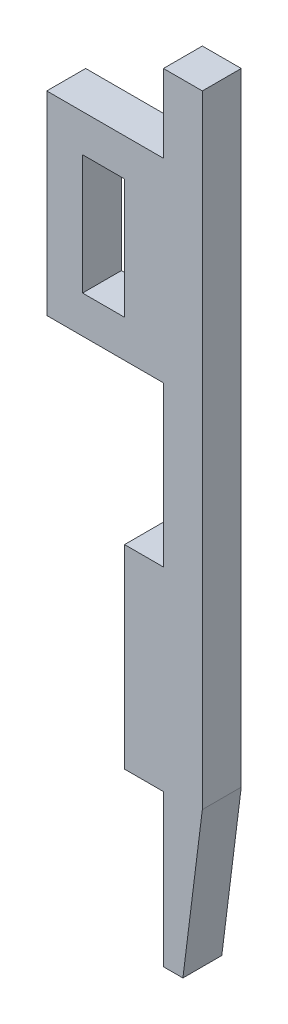
ISO-10303-21;
HEADER;
FILE_DESCRIPTION(('STEP AP214'),'2;1');
FILE_NAME('part.step','',(''),(''),'','','');
FILE_SCHEMA(('AUTOMOTIVE_DESIGN { 1 0 10303 214 1 1 1 1 }'));
ENDSEC;
DATA;
#1=APPLICATION_CONTEXT('core data for automotive mechanical design processes');
#2=APPLICATION_PROTOCOL_DEFINITION('international standard','automotive_design',2000,#1);
#3=PRODUCT_CONTEXT('',#1,'mechanical');
#4=PRODUCT('Part','Part','',(#3));
#5=PRODUCT_RELATED_PRODUCT_CATEGORY('part','',(#4));
#6=PRODUCT_DEFINITION_FORMATION('','',#4);
#7=PRODUCT_DEFINITION_CONTEXT('part definition',#1,'design');
#8=PRODUCT_DEFINITION('design','',#6,#7);
#9=PRODUCT_DEFINITION_SHAPE('','',#8);
#10=(LENGTH_UNIT() NAMED_UNIT(*) SI_UNIT(.MILLI.,.METRE.));
#11=(NAMED_UNIT(*) PLANE_ANGLE_UNIT() SI_UNIT($,.RADIAN.));
#12=(NAMED_UNIT(*) SI_UNIT($,.STERADIAN.) SOLID_ANGLE_UNIT());
#13=UNCERTAINTY_MEASURE_WITH_UNIT(LENGTH_MEASURE(1.E-05),#10,'distance_accuracy_value','');
#14=(GEOMETRIC_REPRESENTATION_CONTEXT(3) GLOBAL_UNCERTAINTY_ASSIGNED_CONTEXT((#13)) GLOBAL_UNIT_ASSIGNED_CONTEXT((#10,
#11,#12)) REPRESENTATION_CONTEXT('',''));
#15=CARTESIAN_POINT('',(0.,0.,0.));
#16=DIRECTION('',(0.,0.,1.));
#17=DIRECTION('',(1.,0.,0.));
#18=AXIS2_PLACEMENT_3D('',#15,#16,#17);
#19=CARTESIAN_POINT('',(0.,0.,5.));
#20=DIRECTION('',(0.,0.,1.));
#21=DIRECTION('',(1.,0.,0.));
#22=AXIS2_PLACEMENT_3D('',#19,#20,#21);
#23=PLANE('',#22);
#24=DIRECTION('',(0.,1.,0.));
#25=VECTOR('',#24,1.);
#26=CARTESIAN_POINT('',(-5.00000000000001,39.5,5.));
#27=LINE('',#26,#25);
#28=CARTESIAN_POINT('',(-5.,19.5,5.));
#29=VERTEX_POINT('',#28);
#30=CARTESIAN_POINT('',(-5.00000000000001,44.5,5.));
#31=VERTEX_POINT('',#30);
#32=EDGE_CURVE('E152',#29,#31,#27,.T.);
#33=ORIENTED_EDGE('',*,*,#32,.F.);
#34=DIRECTION('',(1.,0.,0.));
#35=VECTOR('',#34,1.);
#36=CARTESIAN_POINT('',(-15.,19.5,5.));
#37=LINE('',#36,#35);
#38=CARTESIAN_POINT('',(0.,19.5,5.));
#39=VERTEX_POINT('',#38);
#40=EDGE_CURVE('E157',#29,#39,#37,.T.);
#41=ORIENTED_EDGE('',*,*,#40,.T.);
#42=DIRECTION('',(0.,-1.,0.));
#43=VECTOR('',#42,1.);
#44=CARTESIAN_POINT('',(0.,19.5,5.));
#45=LINE('',#44,#43);
#46=CARTESIAN_POINT('',(0.,0.,5.));
#47=VERTEX_POINT('',#46);
#48=EDGE_CURVE('E210',#39,#47,#45,.T.);
#49=ORIENTED_EDGE('',*,*,#48,.T.);
#50=DIRECTION('',(1.,0.,0.));
#51=VECTOR('',#50,1.);
#52=CARTESIAN_POINT('',(0.,0.,5.));
#53=LINE('',#52,#51);
#54=CARTESIAN_POINT('',(2.5,0.,5.));
#55=VERTEX_POINT('',#54);
#56=EDGE_CURVE('E309',#47,#55,#53,.T.);
#57=ORIENTED_EDGE('',*,*,#56,.T.);
#58=DIRECTION('',(0.124034734589208,0.992277876713668,0.));
#59=VECTOR('',#58,1.);
#60=CARTESIAN_POINT('',(2.5,0.,5.));
#61=LINE('',#60,#59);
#62=CARTESIAN_POINT('',(5.,20.,5.));
#63=VERTEX_POINT('',#62);
#64=EDGE_CURVE('E241',#55,#63,#61,.T.);
#65=ORIENTED_EDGE('',*,*,#64,.T.);
#66=DIRECTION('',(0.,1.,0.));
#67=VECTOR('',#66,1.);
#68=CARTESIAN_POINT('',(5.,20.,5.));
#69=LINE('',#68,#67);
#70=CARTESIAN_POINT('',(5.,100.,5.));
#71=VERTEX_POINT('',#70);
#72=EDGE_CURVE('E260',#63,#71,#69,.T.);
#73=ORIENTED_EDGE('',*,*,#72,.T.);
#74=DIRECTION('',(-1.,0.,0.));
#75=VECTOR('',#74,1.);
#76=CARTESIAN_POINT('',(5.,100.,5.));
#77=LINE('',#76,#75);
#78=CARTESIAN_POINT('',(0.,100.,5.));
#79=VERTEX_POINT('',#78);
#80=EDGE_CURVE('E257',#71,#79,#77,.T.);
#81=ORIENTED_EDGE('',*,*,#80,.T.);
#82=DIRECTION('',(0.,-1.,0.));
#83=VECTOR('',#82,1.);
#84=CARTESIAN_POINT('',(0.,100.,5.));
#85=LINE('',#84,#83);
#86=CARTESIAN_POINT('',(0.,90.,5.));
#87=VERTEX_POINT('',#86);
#88=EDGE_CURVE('E259',#79,#87,#85,.T.);
#89=ORIENTED_EDGE('',*,*,#88,.T.);
#90=DIRECTION('',(-1.,0.,0.));
#91=VECTOR('',#90,1.);
#92=CARTESIAN_POINT('',(0.,90.,5.));
#93=LINE('',#92,#91);
#94=CARTESIAN_POINT('',(-15.,90.,5.));
#95=VERTEX_POINT('',#94);
#96=EDGE_CURVE('E262',#87,#95,#93,.T.);
#97=ORIENTED_EDGE('',*,*,#96,.T.);
#98=DIRECTION('',(0.,-1.,0.));
#99=VECTOR('',#98,1.);
#100=CARTESIAN_POINT('',(-15.,90.,5.));
#101=LINE('',#100,#99);
#102=CARTESIAN_POINT('',(-15.,65.,5.));
#103=VERTEX_POINT('',#102);
#104=EDGE_CURVE('E268',#95,#103,#101,.T.);
#105=ORIENTED_EDGE('',*,*,#104,.T.);
#106=DIRECTION('',(1.,0.,0.));
#107=VECTOR('',#106,1.);
#108=CARTESIAN_POINT('',(-15.,65.,5.));
#109=LINE('',#108,#107);
#110=CARTESIAN_POINT('',(0.,65.,5.));
#111=VERTEX_POINT('',#110);
#112=EDGE_CURVE('E270',#103,#111,#109,.T.);
#113=ORIENTED_EDGE('',*,*,#112,.T.);
#114=DIRECTION('',(0.,-1.,0.));
#115=VECTOR('',#114,1.);
#116=CARTESIAN_POINT('',(0.,65.,5.));
#117=LINE('',#116,#115);
#118=CARTESIAN_POINT('',(0.,44.5,5.));
#119=VERTEX_POINT('',#118);
#120=EDGE_CURVE('E180',#111,#119,#117,.T.);
#121=ORIENTED_EDGE('',*,*,#120,.T.);
#122=DIRECTION('',(-1.,0.,0.));
#123=VECTOR('',#122,1.);
#124=CARTESIAN_POINT('',(0.,44.5,5.));
#125=LINE('',#124,#123);
#126=EDGE_CURVE('E160',#119,#31,#125,.T.);
#127=ORIENTED_EDGE('',*,*,#126,.T.);
#128=EDGE_LOOP('',(#33,#41,#49,#57,#65,#73,#81,#89,#97,#105,#113,#121,#127));
#129=FACE_BOUND('',#128,.T.);
#130=DIRECTION('',(1.,0.,0.));
#131=VECTOR('',#130,1.);
#132=CARTESIAN_POINT('',(-10.4,69.8,5.));
#133=LINE('',#132,#131);
#134=CARTESIAN_POINT('',(-10.4,69.8,5.));
#135=VERTEX_POINT('',#134);
#136=CARTESIAN_POINT('',(-5.00000000000001,69.8,5.));
#137=VERTEX_POINT('',#136);
#138=EDGE_CURVE('E286',#135,#137,#133,.T.);
#139=ORIENTED_EDGE('',*,*,#138,.F.);
#140=DIRECTION('',(0.,-1.,0.));
#141=VECTOR('',#140,1.);
#142=CARTESIAN_POINT('',(-10.4,85.2,5.));
#143=LINE('',#142,#141);
#144=CARTESIAN_POINT('',(-10.4,85.2,5.));
#145=VERTEX_POINT('',#144);
#146=EDGE_CURVE('E284',#145,#135,#143,.T.);
#147=ORIENTED_EDGE('',*,*,#146,.F.);
#148=DIRECTION('',(-1.,0.,0.));
#149=VECTOR('',#148,1.);
#150=CARTESIAN_POINT('',(-10.4,85.2,5.));
#151=LINE('',#150,#149);
#152=CARTESIAN_POINT('',(-5.00000000000001,85.2,5.));
#153=VERTEX_POINT('',#152);
#154=EDGE_CURVE('E291',#153,#145,#151,.T.);
#155=ORIENTED_EDGE('',*,*,#154,.F.);
#156=DIRECTION('',(0.,1.,0.));
#157=VECTOR('',#156,1.);
#158=CARTESIAN_POINT('',(-5.00000000000001,85.2,5.));
#159=LINE('',#158,#157);
#160=EDGE_CURVE('E289',#137,#153,#159,.T.);
#161=ORIENTED_EDGE('',*,*,#160,.F.);
#162=EDGE_LOOP('',(#139,#147,#155,#161));
#163=FACE_BOUND('',#162,.T.);
#164=ADVANCED_FACE('F32',(#129,#163),#23,.T.);
#165=CARTESIAN_POINT('',(0.,0.,0.));
#166=DIRECTION('',(0.,0.,1.));
#167=DIRECTION('',(1.,0.,0.));
#168=AXIS2_PLACEMENT_3D('',#165,#166,#167);
#169=PLANE('',#168);
#170=DIRECTION('',(0.,-1.,0.));
#171=VECTOR('',#170,1.);
#172=CARTESIAN_POINT('',(-10.4,85.2,0.));
#173=LINE('',#172,#171);
#174=CARTESIAN_POINT('',(-10.4,85.2,0.));
#175=VERTEX_POINT('',#174);
#176=CARTESIAN_POINT('',(-10.4,69.8,0.));
#177=VERTEX_POINT('',#176);
#178=EDGE_CURVE('E55',#175,#177,#173,.T.);
#179=ORIENTED_EDGE('',*,*,#178,.T.);
#180=DIRECTION('',(1.,0.,0.));
#181=VECTOR('',#180,1.);
#182=CARTESIAN_POINT('',(-10.4,69.8,0.));
#183=LINE('',#182,#181);
#184=CARTESIAN_POINT('',(-5.00000000000001,69.8,0.));
#185=VERTEX_POINT('',#184);
#186=EDGE_CURVE('E295',#177,#185,#183,.T.);
#187=ORIENTED_EDGE('',*,*,#186,.T.);
#188=DIRECTION('',(0.,1.,0.));
#189=VECTOR('',#188,1.);
#190=CARTESIAN_POINT('',(-5.00000000000001,85.2,0.));
#191=LINE('',#190,#189);
#192=CARTESIAN_POINT('',(-5.00000000000001,85.2,0.));
#193=VERTEX_POINT('',#192);
#194=EDGE_CURVE('E298',#185,#193,#191,.T.);
#195=ORIENTED_EDGE('',*,*,#194,.T.);
#196=DIRECTION('',(-1.,0.,0.));
#197=VECTOR('',#196,1.);
#198=CARTESIAN_POINT('',(-10.4,85.2,0.));
#199=LINE('',#198,#197);
#200=EDGE_CURVE('E287',#193,#175,#199,.T.);
#201=ORIENTED_EDGE('',*,*,#200,.T.);
#202=EDGE_LOOP('',(#179,#187,#195,#201));
#203=FACE_BOUND('',#202,.T.);
#204=DIRECTION('',(1.,0.,0.));
#205=VECTOR('',#204,1.);
#206=CARTESIAN_POINT('',(-15.,19.5,0.));
#207=LINE('',#206,#205);
#208=CARTESIAN_POINT('',(-5.,19.5,0.));
#209=VERTEX_POINT('',#208);
#210=CARTESIAN_POINT('',(0.,19.5,0.));
#211=VERTEX_POINT('',#210);
#212=EDGE_CURVE('E209',#209,#211,#207,.T.);
#213=ORIENTED_EDGE('',*,*,#212,.F.);
#214=DIRECTION('',(0.,1.,0.));
#215=VECTOR('',#214,1.);
#216=CARTESIAN_POINT('',(-5.00000000000001,39.5,0.));
#217=LINE('',#216,#215);
#218=CARTESIAN_POINT('',(-5.00000000000001,44.5,0.));
#219=VERTEX_POINT('',#218);
#220=EDGE_CURVE('E164',#209,#219,#217,.T.);
#221=ORIENTED_EDGE('',*,*,#220,.T.);
#222=DIRECTION('',(-1.,0.,0.));
#223=VECTOR('',#222,1.);
#224=CARTESIAN_POINT('',(0.,44.5,0.));
#225=LINE('',#224,#223);
#226=CARTESIAN_POINT('',(0.,44.5,0.));
#227=VERTEX_POINT('',#226);
#228=EDGE_CURVE('E206',#227,#219,#225,.T.);
#229=ORIENTED_EDGE('',*,*,#228,.F.);
#230=DIRECTION('',(0.,-1.,0.));
#231=VECTOR('',#230,1.);
#232=CARTESIAN_POINT('',(0.,65.,0.));
#233=LINE('',#232,#231);
#234=CARTESIAN_POINT('',(0.,65.,0.));
#235=VERTEX_POINT('',#234);
#236=EDGE_CURVE('E204',#235,#227,#233,.T.);
#237=ORIENTED_EDGE('',*,*,#236,.F.);
#238=DIRECTION('',(1.,0.,0.));
#239=VECTOR('',#238,1.);
#240=CARTESIAN_POINT('',(-15.,65.,0.));
#241=LINE('',#240,#239);
#242=CARTESIAN_POINT('',(-15.,65.,0.));
#243=VERTEX_POINT('',#242);
#244=EDGE_CURVE('E202',#243,#235,#241,.T.);
#245=ORIENTED_EDGE('',*,*,#244,.F.);
#246=DIRECTION('',(0.,-1.,0.));
#247=VECTOR('',#246,1.);
#248=CARTESIAN_POINT('',(-15.,90.,0.));
#249=LINE('',#248,#247);
#250=CARTESIAN_POINT('',(-15.,90.,0.));
#251=VERTEX_POINT('',#250);
#252=EDGE_CURVE('E200',#251,#243,#249,.T.);
#253=ORIENTED_EDGE('',*,*,#252,.F.);
#254=DIRECTION('',(-1.,0.,0.));
#255=VECTOR('',#254,1.);
#256=CARTESIAN_POINT('',(0.,90.,0.));
#257=LINE('',#256,#255);
#258=CARTESIAN_POINT('',(0.,90.,0.));
#259=VERTEX_POINT('',#258);
#260=EDGE_CURVE('E198',#259,#251,#257,.T.);
#261=ORIENTED_EDGE('',*,*,#260,.F.);
#262=DIRECTION('',(0.,-1.,0.));
#263=VECTOR('',#262,1.);
#264=CARTESIAN_POINT('',(0.,100.,0.));
#265=LINE('',#264,#263);
#266=CARTESIAN_POINT('',(0.,100.,0.));
#267=VERTEX_POINT('',#266);
#268=EDGE_CURVE('E196',#267,#259,#265,.T.);
#269=ORIENTED_EDGE('',*,*,#268,.F.);
#270=DIRECTION('',(-1.,0.,0.));
#271=VECTOR('',#270,1.);
#272=CARTESIAN_POINT('',(5.,100.,0.));
#273=LINE('',#272,#271);
#274=CARTESIAN_POINT('',(5.,100.,0.));
#275=VERTEX_POINT('',#274);
#276=EDGE_CURVE('E194',#275,#267,#273,.T.);
#277=ORIENTED_EDGE('',*,*,#276,.F.);
#278=DIRECTION('',(0.,1.,0.));
#279=VECTOR('',#278,1.);
#280=CARTESIAN_POINT('',(5.,20.,0.));
#281=LINE('',#280,#279);
#282=CARTESIAN_POINT('',(5.,20.,0.));
#283=VERTEX_POINT('',#282);
#284=EDGE_CURVE('E192',#283,#275,#281,.T.);
#285=ORIENTED_EDGE('',*,*,#284,.F.);
#286=DIRECTION('',(0.124034734589208,0.992277876713668,0.));
#287=VECTOR('',#286,1.);
#288=CARTESIAN_POINT('',(2.5,0.,0.));
#289=LINE('',#288,#287);
#290=CARTESIAN_POINT('',(2.5,0.,0.));
#291=VERTEX_POINT('',#290);
#292=EDGE_CURVE('E190',#291,#283,#289,.T.);
#293=ORIENTED_EDGE('',*,*,#292,.F.);
#294=DIRECTION('',(1.,0.,0.));
#295=VECTOR('',#294,1.);
#296=CARTESIAN_POINT('',(0.,0.,0.));
#297=LINE('',#296,#295);
#298=CARTESIAN_POINT('',(0.,0.,0.));
#299=VERTEX_POINT('',#298);
#300=EDGE_CURVE('E187',#299,#291,#297,.T.);
#301=ORIENTED_EDGE('',*,*,#300,.F.);
#302=DIRECTION('',(0.,-1.,0.));
#303=VECTOR('',#302,1.);
#304=CARTESIAN_POINT('',(0.,19.5,0.));
#305=LINE('',#304,#303);
#306=EDGE_CURVE('E184',#211,#299,#305,.T.);
#307=ORIENTED_EDGE('',*,*,#306,.F.);
#308=EDGE_LOOP('',(#213,#221,#229,#237,#245,#253,#261,#269,#277,#285,#293,#301,#307));
#309=FACE_BOUND('',#308,.T.);
#310=ADVANCED_FACE('F245',(#203,#309),#169,.F.);
#311=CARTESIAN_POINT('',(0.,19.5,5.));
#312=DIRECTION('',(1.,0.,0.));
#313=DIRECTION('',(0.,1.,0.));
#314=AXIS2_PLACEMENT_3D('',#311,#312,#313);
#315=PLANE('',#314);
#316=ORIENTED_EDGE('',*,*,#306,.T.);
#317=DIRECTION('',(0.,0.,-1.));
#318=VECTOR('',#317,1.);
#319=CARTESIAN_POINT('',(0.,0.,5.));
#320=LINE('',#319,#318);
#321=EDGE_CURVE('E11',#47,#299,#320,.T.);
#322=ORIENTED_EDGE('',*,*,#321,.F.);
#323=ORIENTED_EDGE('',*,*,#48,.F.);
#324=DIRECTION('',(0.,0.,-1.));
#325=VECTOR('',#324,1.);
#326=CARTESIAN_POINT('',(0.,19.5,5.));
#327=LINE('',#326,#325);
#328=EDGE_CURVE('E175',#39,#211,#327,.T.);
#329=ORIENTED_EDGE('',*,*,#328,.T.);
#330=EDGE_LOOP('',(#316,#322,#323,#329));
#331=FACE_BOUND('',#330,.T.);
#332=ADVANCED_FACE('F34',(#331),#315,.F.);
#333=CARTESIAN_POINT('',(0.,0.,5.));
#334=DIRECTION('',(0.,1.,0.));
#335=DIRECTION('',(0.,0.,1.));
#336=AXIS2_PLACEMENT_3D('',#333,#334,#335);
#337=PLANE('',#336);
#338=ORIENTED_EDGE('',*,*,#300,.T.);
#339=DIRECTION('',(0.,0.,-1.));
#340=VECTOR('',#339,1.);
#341=CARTESIAN_POINT('',(2.5,0.,5.));
#342=LINE('',#341,#340);
#343=EDGE_CURVE('E40',#55,#291,#342,.T.);
#344=ORIENTED_EDGE('',*,*,#343,.F.);
#345=ORIENTED_EDGE('',*,*,#56,.F.);
#346=ORIENTED_EDGE('',*,*,#321,.T.);
#347=EDGE_LOOP('',(#338,#344,#345,#346));
#348=FACE_BOUND('',#347,.T.);
#349=ADVANCED_FACE('F311',(#348),#337,.F.);
#350=CARTESIAN_POINT('',(2.5,0.,5.));
#351=DIRECTION('',(-0.992277876713668,0.124034734589208,0.));
#352=DIRECTION('',(-0.124034734589208,-0.992277876713668,0.));
#353=AXIS2_PLACEMENT_3D('',#350,#351,#352);
#354=PLANE('',#353);
#355=ORIENTED_EDGE('',*,*,#292,.T.);
#356=DIRECTION('',(0.,0.,-1.));
#357=VECTOR('',#356,1.);
#358=CARTESIAN_POINT('',(5.,20.,5.));
#359=LINE('',#358,#357);
#360=EDGE_CURVE('E232',#63,#283,#359,.T.);
#361=ORIENTED_EDGE('',*,*,#360,.F.);
#362=ORIENTED_EDGE('',*,*,#64,.F.);
#363=ORIENTED_EDGE('',*,*,#343,.T.);
#364=EDGE_LOOP('',(#355,#361,#362,#363));
#365=FACE_BOUND('',#364,.T.);
#366=ADVANCED_FACE('F239',(#365),#354,.F.);
#367=CARTESIAN_POINT('',(5.,20.,5.));
#368=DIRECTION('',(-1.,0.,0.));
#369=DIRECTION('',(0.,0.,1.));
#370=AXIS2_PLACEMENT_3D('',#367,#368,#369);
#371=PLANE('',#370);
#372=ORIENTED_EDGE('',*,*,#284,.T.);
#373=DIRECTION('',(0.,0.,-1.));
#374=VECTOR('',#373,1.);
#375=CARTESIAN_POINT('',(5.,100.,5.));
#376=LINE('',#375,#374);
#377=EDGE_CURVE('E229',#71,#275,#376,.T.);
#378=ORIENTED_EDGE('',*,*,#377,.F.);
#379=ORIENTED_EDGE('',*,*,#72,.F.);
#380=ORIENTED_EDGE('',*,*,#360,.T.);
#381=EDGE_LOOP('',(#372,#378,#379,#380));
#382=FACE_BOUND('',#381,.T.);
#383=ADVANCED_FACE('F251',(#382),#371,.F.);
#384=CARTESIAN_POINT('',(5.,100.,5.));
#385=DIRECTION('',(0.,-1.,0.));
#386=DIRECTION('',(0.,0.,-1.));
#387=AXIS2_PLACEMENT_3D('',#384,#385,#386);
#388=PLANE('',#387);
#389=ORIENTED_EDGE('',*,*,#276,.T.);
#390=DIRECTION('',(0.,0.,-1.));
#391=VECTOR('',#390,1.);
#392=CARTESIAN_POINT('',(0.,100.,5.));
#393=LINE('',#392,#391);
#394=EDGE_CURVE('E226',#79,#267,#393,.T.);
#395=ORIENTED_EDGE('',*,*,#394,.F.);
#396=ORIENTED_EDGE('',*,*,#80,.F.);
#397=ORIENTED_EDGE('',*,*,#377,.T.);
#398=EDGE_LOOP('',(#389,#395,#396,#397));
#399=FACE_BOUND('',#398,.T.);
#400=ADVANCED_FACE('F255',(#399),#388,.F.);
#401=CARTESIAN_POINT('',(0.,100.,5.));
#402=DIRECTION('',(1.,0.,0.));
#403=DIRECTION('',(0.,1.,0.));
#404=AXIS2_PLACEMENT_3D('',#401,#402,#403);
#405=PLANE('',#404);
#406=ORIENTED_EDGE('',*,*,#268,.T.);
#407=DIRECTION('',(0.,0.,-1.));
#408=VECTOR('',#407,1.);
#409=CARTESIAN_POINT('',(0.,90.,5.));
#410=LINE('',#409,#408);
#411=EDGE_CURVE('E223',#87,#259,#410,.T.);
#412=ORIENTED_EDGE('',*,*,#411,.F.);
#413=ORIENTED_EDGE('',*,*,#88,.F.);
#414=ORIENTED_EDGE('',*,*,#394,.T.);
#415=EDGE_LOOP('',(#406,#412,#413,#414));
#416=FACE_BOUND('',#415,.T.);
#417=ADVANCED_FACE('F328',(#416),#405,.F.);
#418=CARTESIAN_POINT('',(0.,90.,5.));
#419=DIRECTION('',(0.,-1.,0.));
#420=DIRECTION('',(1.,0.,0.));
#421=AXIS2_PLACEMENT_3D('',#418,#419,#420);
#422=PLANE('',#421);
#423=ORIENTED_EDGE('',*,*,#260,.T.);
#424=DIRECTION('',(0.,0.,-1.));
#425=VECTOR('',#424,1.);
#426=CARTESIAN_POINT('',(-15.,90.,5.));
#427=LINE('',#426,#425);
#428=EDGE_CURVE('E220',#95,#251,#427,.T.);
#429=ORIENTED_EDGE('',*,*,#428,.F.);
#430=ORIENTED_EDGE('',*,*,#96,.F.);
#431=ORIENTED_EDGE('',*,*,#411,.T.);
#432=EDGE_LOOP('',(#423,#429,#430,#431));
#433=FACE_BOUND('',#432,.T.);
#434=ADVANCED_FACE('F325',(#433),#422,.F.);
#435=CARTESIAN_POINT('',(-15.,90.,5.));
#436=DIRECTION('',(1.,0.,0.));
#437=DIRECTION('',(0.,1.,0.));
#438=AXIS2_PLACEMENT_3D('',#435,#436,#437);
#439=PLANE('',#438);
#440=ORIENTED_EDGE('',*,*,#252,.T.);
#441=DIRECTION('',(0.,0.,-1.));
#442=VECTOR('',#441,1.);
#443=CARTESIAN_POINT('',(-15.,65.,5.));
#444=LINE('',#443,#442);
#445=EDGE_CURVE('E217',#103,#243,#444,.T.);
#446=ORIENTED_EDGE('',*,*,#445,.F.);
#447=ORIENTED_EDGE('',*,*,#104,.F.);
#448=ORIENTED_EDGE('',*,*,#428,.T.);
#449=EDGE_LOOP('',(#440,#446,#447,#448));
#450=FACE_BOUND('',#449,.T.);
#451=ADVANCED_FACE('F321',(#450),#439,.F.);
#452=CARTESIAN_POINT('',(-15.,65.,5.));
#453=DIRECTION('',(0.,1.,0.));
#454=DIRECTION('',(0.,0.,1.));
#455=AXIS2_PLACEMENT_3D('',#452,#453,#454);
#456=PLANE('',#455);
#457=ORIENTED_EDGE('',*,*,#244,.T.);
#458=DIRECTION('',(0.,0.,-1.));
#459=VECTOR('',#458,1.);
#460=CARTESIAN_POINT('',(0.,65.,5.));
#461=LINE('',#460,#459);
#462=EDGE_CURVE('E214',#111,#235,#461,.T.);
#463=ORIENTED_EDGE('',*,*,#462,.F.);
#464=ORIENTED_EDGE('',*,*,#112,.F.);
#465=ORIENTED_EDGE('',*,*,#445,.T.);
#466=EDGE_LOOP('',(#457,#463,#464,#465));
#467=FACE_BOUND('',#466,.T.);
#468=ADVANCED_FACE('F317',(#467),#456,.F.);
#469=CARTESIAN_POINT('',(0.,65.,5.));
#470=DIRECTION('',(1.,0.,0.));
#471=DIRECTION('',(0.,1.,0.));
#472=AXIS2_PLACEMENT_3D('',#469,#470,#471);
#473=PLANE('',#472);
#474=ORIENTED_EDGE('',*,*,#236,.T.);
#475=DIRECTION('',(0.,0.,-1.));
#476=VECTOR('',#475,1.);
#477=CARTESIAN_POINT('',(0.,44.5,5.));
#478=LINE('',#477,#476);
#479=EDGE_CURVE('E178',#119,#227,#478,.T.);
#480=ORIENTED_EDGE('',*,*,#479,.F.);
#481=ORIENTED_EDGE('',*,*,#120,.F.);
#482=ORIENTED_EDGE('',*,*,#462,.T.);
#483=EDGE_LOOP('',(#474,#480,#481,#482));
#484=FACE_BOUND('',#483,.T.);
#485=ADVANCED_FACE('F276',(#484),#473,.F.);
#486=CARTESIAN_POINT('',(0.,44.5,5.));
#487=DIRECTION('',(0.,-1.,0.));
#488=DIRECTION('',(0.,0.,-1.));
#489=AXIS2_PLACEMENT_3D('',#486,#487,#488);
#490=PLANE('',#489);
#491=ORIENTED_EDGE('',*,*,#228,.T.);
#492=DIRECTION('',(0.,0.,1.));
#493=VECTOR('',#492,1.);
#494=CARTESIAN_POINT('',(-5.00000000000001,44.5,-5.));
#495=LINE('',#494,#493);
#496=EDGE_CURVE('E171',#219,#31,#495,.T.);
#497=ORIENTED_EDGE('',*,*,#496,.T.);
#498=ORIENTED_EDGE('',*,*,#126,.F.);
#499=ORIENTED_EDGE('',*,*,#479,.T.);
#500=EDGE_LOOP('',(#491,#497,#498,#499));
#501=FACE_BOUND('',#500,.T.);
#502=ADVANCED_FACE('F280',(#501),#490,.F.);
#503=CARTESIAN_POINT('',(-15.,19.5,5.));
#504=DIRECTION('',(0.,1.,0.));
#505=DIRECTION('',(0.,0.,1.));
#506=AXIS2_PLACEMENT_3D('',#503,#504,#505);
#507=PLANE('',#506);
#508=ORIENTED_EDGE('',*,*,#40,.F.);
#509=DIRECTION('',(0.,0.,1.));
#510=VECTOR('',#509,1.);
#511=CARTESIAN_POINT('',(-5.,19.5,-5.));
#512=LINE('',#511,#510);
#513=EDGE_CURVE('E167',#209,#29,#512,.T.);
#514=ORIENTED_EDGE('',*,*,#513,.F.);
#515=ORIENTED_EDGE('',*,*,#212,.T.);
#516=ORIENTED_EDGE('',*,*,#328,.F.);
#517=EDGE_LOOP('',(#508,#514,#515,#516));
#518=FACE_BOUND('',#517,.T.);
#519=ADVANCED_FACE('F173',(#518),#507,.F.);
#520=CARTESIAN_POINT('',(-10.4,85.2,5.));
#521=DIRECTION('',(1.,0.,0.));
#522=DIRECTION('',(0.,1.,0.));
#523=AXIS2_PLACEMENT_3D('',#520,#521,#522);
#524=PLANE('',#523);
#525=ORIENTED_EDGE('',*,*,#178,.F.);
#526=DIRECTION('',(0.,0.,-1.));
#527=VECTOR('',#526,1.);
#528=CARTESIAN_POINT('',(-10.4,85.2,5.));
#529=LINE('',#528,#527);
#530=EDGE_CURVE('E293',#145,#175,#529,.T.);
#531=ORIENTED_EDGE('',*,*,#530,.F.);
#532=ORIENTED_EDGE('',*,*,#146,.T.);
#533=DIRECTION('',(0.,0.,-1.));
#534=VECTOR('',#533,1.);
#535=CARTESIAN_POINT('',(-10.4,69.8,5.));
#536=LINE('',#535,#534);
#537=EDGE_CURVE('E188',#135,#177,#536,.T.);
#538=ORIENTED_EDGE('',*,*,#537,.T.);
#539=EDGE_LOOP('',(#525,#531,#532,#538));
#540=FACE_BOUND('',#539,.T.);
#541=ADVANCED_FACE('F345',(#540),#524,.T.);
#542=CARTESIAN_POINT('',(-10.4,69.8,5.));
#543=DIRECTION('',(0.,1.,0.));
#544=DIRECTION('',(0.,0.,1.));
#545=AXIS2_PLACEMENT_3D('',#542,#543,#544);
#546=PLANE('',#545);
#547=ORIENTED_EDGE('',*,*,#186,.F.);
#548=ORIENTED_EDGE('',*,*,#537,.F.);
#549=ORIENTED_EDGE('',*,*,#138,.T.);
#550=DIRECTION('',(0.,0.,-1.));
#551=VECTOR('',#550,1.);
#552=CARTESIAN_POINT('',(-5.00000000000001,69.8,5.));
#553=LINE('',#552,#551);
#554=EDGE_CURVE('E305',#137,#185,#553,.T.);
#555=ORIENTED_EDGE('',*,*,#554,.T.);
#556=EDGE_LOOP('',(#547,#548,#549,#555));
#557=FACE_BOUND('',#556,.T.);
#558=ADVANCED_FACE('F385',(#557),#546,.T.);
#559=CARTESIAN_POINT('',(-5.00000000000001,85.2,5.));
#560=DIRECTION('',(-1.,0.,0.));
#561=DIRECTION('',(0.,-1.,0.));
#562=AXIS2_PLACEMENT_3D('',#559,#560,#561);
#563=PLANE('',#562);
#564=ORIENTED_EDGE('',*,*,#194,.F.);
#565=ORIENTED_EDGE('',*,*,#554,.F.);
#566=ORIENTED_EDGE('',*,*,#160,.T.);
#567=DIRECTION('',(0.,0.,-1.));
#568=VECTOR('',#567,1.);
#569=CARTESIAN_POINT('',(-5.00000000000001,85.2,5.));
#570=LINE('',#569,#568);
#571=EDGE_CURVE('E47',#153,#193,#570,.T.);
#572=ORIENTED_EDGE('',*,*,#571,.T.);
#573=EDGE_LOOP('',(#564,#565,#566,#572));
#574=FACE_BOUND('',#573,.T.);
#575=ADVANCED_FACE('F391',(#574),#563,.T.);
#576=CARTESIAN_POINT('',(-10.4,85.2,5.));
#577=DIRECTION('',(0.,-1.,0.));
#578=DIRECTION('',(0.,0.,-1.));
#579=AXIS2_PLACEMENT_3D('',#576,#577,#578);
#580=PLANE('',#579);
#581=ORIENTED_EDGE('',*,*,#200,.F.);
#582=ORIENTED_EDGE('',*,*,#571,.F.);
#583=ORIENTED_EDGE('',*,*,#154,.T.);
#584=ORIENTED_EDGE('',*,*,#530,.T.);
#585=EDGE_LOOP('',(#581,#582,#583,#584));
#586=FACE_BOUND('',#585,.T.);
#587=ADVANCED_FACE('F398',(#586),#580,.T.);
#588=CARTESIAN_POINT('',(-5.00000000000001,39.5,5.));
#589=DIRECTION('',(-1.,0.,0.));
#590=DIRECTION('',(0.,-1.,0.));
#591=AXIS2_PLACEMENT_3D('',#588,#589,#590);
#592=PLANE('',#591);
#593=ORIENTED_EDGE('',*,*,#220,.F.);
#594=ORIENTED_EDGE('',*,*,#513,.T.);
#595=ORIENTED_EDGE('',*,*,#32,.T.);
#596=ORIENTED_EDGE('',*,*,#496,.F.);
#597=EDGE_LOOP('',(#593,#594,#595,#596));
#598=FACE_BOUND('',#597,.T.);
#599=ADVANCED_FACE('F168',(#598),#592,.T.);
#600=CLOSED_SHELL('',(#164,#310,#332,#349,#366,#383,#400,#417,#434,#451,#468,#485,#502,#519,
#541,#558,#575,#587,#599));
#601=MANIFOLD_SOLID_BREP('B2',#600);
#602=ADVANCED_BREP_SHAPE_REPRESENTATION('',(#18,#601),#14);
#603=SHAPE_DEFINITION_REPRESENTATION(#9,#602);
ENDSEC;
END-ISO-10303-21;
